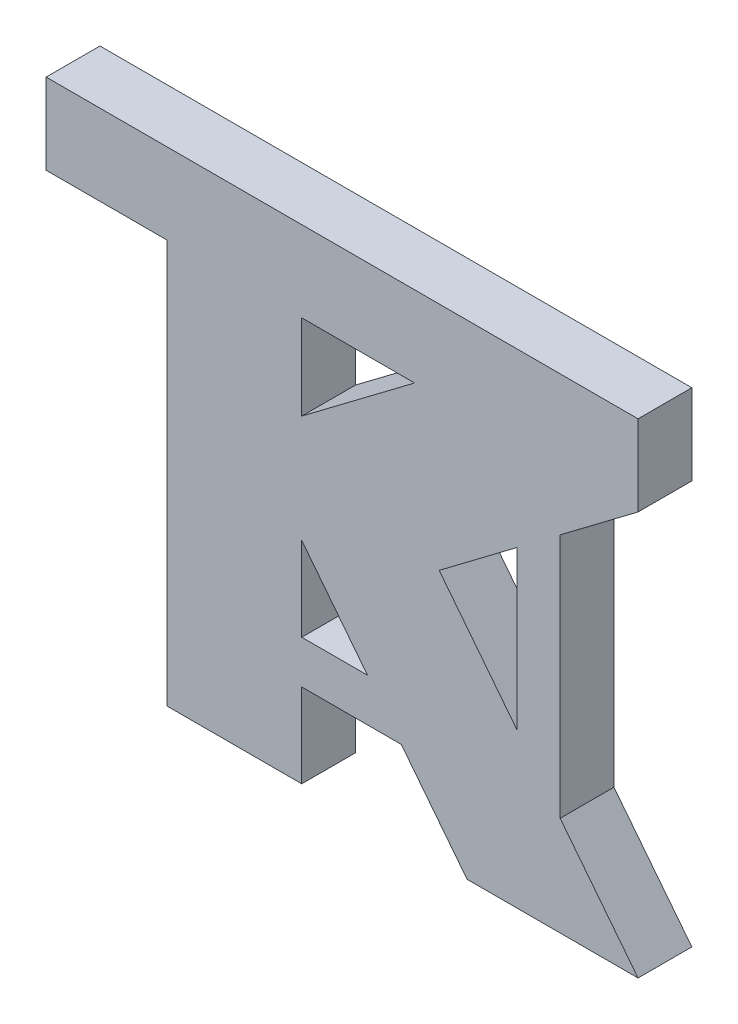
ISO-10303-21;
HEADER;
FILE_DESCRIPTION(('STEP AP214'),'2;1');
FILE_NAME('part.step','',(''),(''),'','','');
FILE_SCHEMA(('AUTOMOTIVE_DESIGN { 1 0 10303 214 1 1 1 1 }'));
ENDSEC;
DATA;
#1=APPLICATION_CONTEXT('core data for automotive mechanical design processes');
#2=APPLICATION_PROTOCOL_DEFINITION('international standard','automotive_design',2000,#1);
#3=PRODUCT_CONTEXT('',#1,'mechanical');
#4=PRODUCT('Part','Part','',(#3));
#5=PRODUCT_RELATED_PRODUCT_CATEGORY('part','',(#4));
#6=PRODUCT_DEFINITION_FORMATION('','',#4);
#7=PRODUCT_DEFINITION_CONTEXT('part definition',#1,'design');
#8=PRODUCT_DEFINITION('design','',#6,#7);
#9=PRODUCT_DEFINITION_SHAPE('','',#8);
#10=(LENGTH_UNIT() NAMED_UNIT(*) SI_UNIT(.MILLI.,.METRE.));
#11=(NAMED_UNIT(*) PLANE_ANGLE_UNIT() SI_UNIT($,.RADIAN.));
#12=(NAMED_UNIT(*) SI_UNIT($,.STERADIAN.) SOLID_ANGLE_UNIT());
#13=UNCERTAINTY_MEASURE_WITH_UNIT(LENGTH_MEASURE(1.E-05),#10,'distance_accuracy_value','');
#14=(GEOMETRIC_REPRESENTATION_CONTEXT(3) GLOBAL_UNCERTAINTY_ASSIGNED_CONTEXT((#13)) GLOBAL_UNIT_ASSIGNED_CONTEXT((#10,
#11,#12)) REPRESENTATION_CONTEXT('',''));
#15=CARTESIAN_POINT('',(0.,0.,0.));
#16=DIRECTION('',(0.,0.,1.));
#17=DIRECTION('',(1.,0.,0.));
#18=AXIS2_PLACEMENT_3D('',#15,#16,#17);
#19=CARTESIAN_POINT('',(-19.3889426707141,25.7141511353692,10.));
#20=DIRECTION('',(0.602051468260526,-0.798457280989625,0.));
#21=DIRECTION('',(0.798457280989625,0.602051468260526,0.));
#22=AXIS2_PLACEMENT_3D('',#19,#20,#21);
#23=PLANE('',#22);
#24=DIRECTION('',(-0.798457280989625,-0.602051468260526,0.));
#25=VECTOR('',#24,1.);
#26=CARTESIAN_POINT('',(-19.3889426707141,25.7141511353692,0.));
#27=LINE('',#26,#25);
#28=CARTESIAN_POINT('',(45.9753109692912,75.,0.));
#29=VERTEX_POINT('',#28);
#30=CARTESIAN_POINT('',(25.,59.1842299307094,0.));
#31=VERTEX_POINT('',#30);
#32=EDGE_CURVE('E209',#29,#31,#27,.T.);
#33=ORIENTED_EDGE('',*,*,#32,.T.);
#34=DIRECTION('',(0.,0.,-1.));
#35=VECTOR('',#34,1.);
#36=CARTESIAN_POINT('',(25.,59.1842299307094,10.));
#37=LINE('',#36,#35);
#38=CARTESIAN_POINT('',(25.,59.1842299307094,10.));
#39=VERTEX_POINT('',#38);
#40=EDGE_CURVE('E12',#39,#31,#37,.T.);
#41=ORIENTED_EDGE('',*,*,#40,.F.);
#42=DIRECTION('',(-0.798457280989625,-0.602051468260526,0.));
#43=VECTOR('',#42,1.);
#44=CARTESIAN_POINT('',(-19.3889426707141,25.7141511353692,10.));
#45=LINE('',#44,#43);
#46=CARTESIAN_POINT('',(45.9753109692912,75.,10.));
#47=VERTEX_POINT('',#46);
#48=EDGE_CURVE('E200',#47,#39,#45,.T.);
#49=ORIENTED_EDGE('',*,*,#48,.F.);
#50=DIRECTION('',(0.,0.,-1.));
#51=VECTOR('',#50,1.);
#52=CARTESIAN_POINT('',(45.9753109692912,75.,10.));
#53=LINE('',#52,#51);
#54=EDGE_CURVE('E210',#47,#29,#53,.T.);
#55=ORIENTED_EDGE('',*,*,#54,.T.);
#56=EDGE_LOOP('',(#33,#41,#49,#55));
#57=FACE_BOUND('',#56,.T.);
#58=ADVANCED_FACE('F38',(#57),#23,.F.);
#59=CARTESIAN_POINT('',(25.,0.,10.));
#60=DIRECTION('',(-1.,0.,0.));
#61=DIRECTION('',(0.,-1.,0.));
#62=AXIS2_PLACEMENT_3D('',#59,#60,#61);
#63=PLANE('',#62);
#64=DIRECTION('',(0.,1.,0.));
#65=VECTOR('',#64,1.);
#66=CARTESIAN_POINT('',(25.,0.,0.));
#67=LINE('',#66,#65);
#68=CARTESIAN_POINT('',(25.,75.,0.));
#69=VERTEX_POINT('',#68);
#70=EDGE_CURVE('E126',#31,#69,#67,.T.);
#71=ORIENTED_EDGE('',*,*,#70,.T.);
#72=DIRECTION('',(0.,0.,-1.));
#73=VECTOR('',#72,1.);
#74=CARTESIAN_POINT('',(25.,75.,10.));
#75=LINE('',#74,#73);
#76=CARTESIAN_POINT('',(25.,75.,10.));
#77=VERTEX_POINT('',#76);
#78=EDGE_CURVE('E48',#77,#69,#75,.T.);
#79=ORIENTED_EDGE('',*,*,#78,.F.);
#80=DIRECTION('',(0.,1.,0.));
#81=VECTOR('',#80,1.);
#82=CARTESIAN_POINT('',(25.,0.,10.));
#83=LINE('',#82,#81);
#84=EDGE_CURVE('E195',#39,#77,#83,.T.);
#85=ORIENTED_EDGE('',*,*,#84,.F.);
#86=ORIENTED_EDGE('',*,*,#40,.T.);
#87=EDGE_LOOP('',(#71,#79,#85,#86));
#88=FACE_BOUND('',#87,.T.);
#89=ADVANCED_FACE('F196',(#88),#63,.F.);
#90=CARTESIAN_POINT('',(65.0194710955794,0.,10.));
#91=DIRECTION('',(1.,0.,0.));
#92=DIRECTION('',(0.,0.,-1.));
#93=AXIS2_PLACEMENT_3D('',#90,#91,#92);
#94=PLANE('',#93);
#95=DIRECTION('',(0.,-1.,0.));
#96=VECTOR('',#95,1.);
#97=CARTESIAN_POINT('',(65.0194710955794,0.,0.));
#98=LINE('',#97,#96);
#99=CARTESIAN_POINT('',(65.0194710955794,58.0492679365328,0.));
#100=VERTEX_POINT('',#99);
#101=CARTESIAN_POINT('',(65.0194710955794,28.6659187518739,0.));
#102=VERTEX_POINT('',#101);
#103=EDGE_CURVE('E220',#100,#102,#98,.T.);
#104=ORIENTED_EDGE('',*,*,#103,.T.);
#105=DIRECTION('',(0.,0.,-1.));
#106=VECTOR('',#105,1.);
#107=CARTESIAN_POINT('',(65.0194710955794,28.6659187518739,10.));
#108=LINE('',#107,#106);
#109=CARTESIAN_POINT('',(65.0194710955794,28.6659187518739,10.));
#110=VERTEX_POINT('',#109);
#111=EDGE_CURVE('E226',#110,#102,#108,.T.);
#112=ORIENTED_EDGE('',*,*,#111,.F.);
#113=DIRECTION('',(0.,-1.,0.));
#114=VECTOR('',#113,1.);
#115=CARTESIAN_POINT('',(65.0194710955794,0.,10.));
#116=LINE('',#115,#114);
#117=CARTESIAN_POINT('',(65.0194710955794,58.0492679365328,10.));
#118=VERTEX_POINT('',#117);
#119=EDGE_CURVE('E381',#118,#110,#116,.T.);
#120=ORIENTED_EDGE('',*,*,#119,.F.);
#121=DIRECTION('',(0.,0.,-1.));
#122=VECTOR('',#121,1.);
#123=CARTESIAN_POINT('',(65.0194710955794,58.0492679365328,10.));
#124=LINE('',#123,#122);
#125=EDGE_CURVE('E228',#118,#100,#124,.T.);
#126=ORIENTED_EDGE('',*,*,#125,.T.);
#127=EDGE_LOOP('',(#104,#112,#120,#126));
#128=FACE_BOUND('',#127,.T.);
#129=ADVANCED_FACE('F349',(#128),#94,.F.);
#130=CARTESIAN_POINT('',(54.1792719022603,42.4887371851497,10.));
#131=DIRECTION('',(0.786887335571602,0.617096687008628,0.));
#132=DIRECTION('',(-0.617096687008628,0.786887335571602,0.));
#133=AXIS2_PLACEMENT_3D('',#130,#131,#132);
#134=PLANE('',#133);
#135=DIRECTION('',(0.617096687008629,-0.786887335571602,0.));
#136=VECTOR('',#135,1.);
#137=CARTESIAN_POINT('',(54.1792719022603,42.4887371851497,0.));
#138=LINE('',#137,#136);
#139=CARTESIAN_POINT('',(50.5389421911588,47.130682940614,0.));
#140=VERTEX_POINT('',#139);
#141=EDGE_CURVE('E216',#140,#102,#138,.T.);
#142=ORIENTED_EDGE('',*,*,#141,.F.);
#143=DIRECTION('',(0.,0.,-1.));
#144=VECTOR('',#143,1.);
#145=CARTESIAN_POINT('',(50.5389421911588,47.130682940614,10.));
#146=LINE('',#145,#144);
#147=CARTESIAN_POINT('',(50.5389421911588,47.130682940614,10.));
#148=VERTEX_POINT('',#147);
#149=EDGE_CURVE('E230',#148,#140,#146,.T.);
#150=ORIENTED_EDGE('',*,*,#149,.F.);
#151=DIRECTION('',(0.617096687008629,-0.786887335571602,0.));
#152=VECTOR('',#151,1.);
#153=CARTESIAN_POINT('',(54.1792719022603,42.4887371851497,10.));
#154=LINE('',#153,#152);
#155=EDGE_CURVE('E376',#148,#110,#154,.T.);
#156=ORIENTED_EDGE('',*,*,#155,.T.);
#157=ORIENTED_EDGE('',*,*,#111,.T.);
#158=EDGE_LOOP('',(#142,#150,#156,#157));
#159=FACE_BOUND('',#158,.T.);
#160=ADVANCED_FACE('F358',(#159),#134,.T.);
#161=CARTESIAN_POINT('',(0.,23.5921149653551,10.));
#162=DIRECTION('',(0.,1.,0.));
#163=DIRECTION('',(0.,0.,1.));
#164=AXIS2_PLACEMENT_3D('',#161,#162,#163);
#165=PLANE('',#164);
#166=DIRECTION('',(1.,0.,0.));
#167=VECTOR('',#166,1.);
#168=CARTESIAN_POINT('',(0.,23.5921149653551,0.));
#169=LINE('',#168,#167);
#170=CARTESIAN_POINT('',(25.,23.5921149653551,0.));
#171=VERTEX_POINT('',#170);
#172=CARTESIAN_POINT('',(37.2277256903476,23.5921149653551,0.));
#173=VERTEX_POINT('',#172);
#174=EDGE_CURVE('E288',#171,#173,#169,.T.);
#175=ORIENTED_EDGE('',*,*,#174,.F.);
#176=DIRECTION('',(0.,0.,-1.));
#177=VECTOR('',#176,1.);
#178=CARTESIAN_POINT('',(25.,23.5921149653551,10.));
#179=LINE('',#178,#177);
#180=CARTESIAN_POINT('',(25.,23.5921149653551,10.));
#181=VERTEX_POINT('',#180);
#182=EDGE_CURVE('E231',#181,#171,#179,.T.);
#183=ORIENTED_EDGE('',*,*,#182,.F.);
#184=DIRECTION('',(1.,0.,0.));
#185=VECTOR('',#184,1.);
#186=CARTESIAN_POINT('',(0.,23.5921149653551,10.));
#187=LINE('',#186,#185);
#188=CARTESIAN_POINT('',(37.2277256903476,23.5921149653551,10.));
#189=VERTEX_POINT('',#188);
#190=EDGE_CURVE('E432',#181,#189,#187,.T.);
#191=ORIENTED_EDGE('',*,*,#190,.T.);
#192=DIRECTION('',(0.,0.,-1.));
#193=VECTOR('',#192,1.);
#194=CARTESIAN_POINT('',(37.2277256903476,23.5921149653551,10.));
#195=LINE('',#194,#193);
#196=EDGE_CURVE('E234',#189,#173,#195,.T.);
#197=ORIENTED_EDGE('',*,*,#196,.T.);
#198=EDGE_LOOP('',(#175,#183,#191,#197));
#199=FACE_BOUND('',#198,.T.);
#200=ADVANCED_FACE('F360',(#199),#165,.T.);
#201=CARTESIAN_POINT('',(25.,0.,10.));
#202=DIRECTION('',(1.,0.,0.));
#203=DIRECTION('',(0.,1.,0.));
#204=AXIS2_PLACEMENT_3D('',#201,#202,#203);
#205=PLANE('',#204);
#206=DIRECTION('',(0.,-1.,0.));
#207=VECTOR('',#206,1.);
#208=CARTESIAN_POINT('',(25.,0.,0.));
#209=LINE('',#208,#207);
#210=CARTESIAN_POINT('',(25.,39.1842299307094,0.));
#211=VERTEX_POINT('',#210);
#212=EDGE_CURVE('E285',#211,#171,#209,.T.);
#213=ORIENTED_EDGE('',*,*,#212,.F.);
#214=DIRECTION('',(0.,0.,-1.));
#215=VECTOR('',#214,1.);
#216=CARTESIAN_POINT('',(25.,39.1842299307094,10.));
#217=LINE('',#216,#215);
#218=CARTESIAN_POINT('',(25.,39.1842299307094,10.));
#219=VERTEX_POINT('',#218);
#220=EDGE_CURVE('E236',#219,#211,#217,.T.);
#221=ORIENTED_EDGE('',*,*,#220,.F.);
#222=DIRECTION('',(0.,-1.,0.));
#223=VECTOR('',#222,1.);
#224=CARTESIAN_POINT('',(25.,0.,10.));
#225=LINE('',#224,#223);
#226=EDGE_CURVE('E442',#219,#181,#225,.T.);
#227=ORIENTED_EDGE('',*,*,#226,.T.);
#228=ORIENTED_EDGE('',*,*,#182,.T.);
#229=EDGE_LOOP('',(#213,#221,#227,#228));
#230=FACE_BOUND('',#229,.T.);
#231=ADVANCED_FACE('F531',(#230),#205,.T.);
#232=CARTESIAN_POINT('',(25.,15.5921149653551,0.));
#233=VERTEX_POINT('',#232);
#234=CARTESIAN_POINT('',(25.,0.,0.));
#235=VERTEX_POINT('',#234);
#236=EDGE_CURVE('E278',#233,#235,#209,.T.);
#237=ORIENTED_EDGE('',*,*,#236,.F.);
#238=DIRECTION('',(0.,0.,-1.));
#239=VECTOR('',#238,1.);
#240=CARTESIAN_POINT('',(25.,15.5921149653551,10.));
#241=LINE('',#240,#239);
#242=CARTESIAN_POINT('',(25.,15.5921149653551,10.));
#243=VERTEX_POINT('',#242);
#244=EDGE_CURVE('E42',#243,#233,#241,.T.);
#245=ORIENTED_EDGE('',*,*,#244,.F.);
#246=CARTESIAN_POINT('',(25.,0.,10.));
#247=VERTEX_POINT('',#246);
#248=EDGE_CURVE('E224',#243,#247,#225,.T.);
#249=ORIENTED_EDGE('',*,*,#248,.T.);
#250=DIRECTION('',(0.,0.,-1.));
#251=VECTOR('',#250,1.);
#252=CARTESIAN_POINT('',(25.,0.,10.));
#253=LINE('',#252,#251);
#254=EDGE_CURVE('E239',#247,#235,#253,.T.);
#255=ORIENTED_EDGE('',*,*,#254,.T.);
#256=EDGE_LOOP('',(#237,#245,#249,#255));
#257=FACE_BOUND('',#256,.T.);
#258=ADVANCED_FACE('F283',(#257),#205,.T.);
#259=CARTESIAN_POINT('',(0.,15.5921149653551,10.));
#260=DIRECTION('',(0.,1.,0.));
#261=DIRECTION('',(0.,0.,1.));
#262=AXIS2_PLACEMENT_3D('',#259,#260,#261);
#263=PLANE('',#262);
#264=DIRECTION('',(1.,0.,0.));
#265=VECTOR('',#264,1.);
#266=CARTESIAN_POINT('',(0.,15.5921149653551,0.));
#267=LINE('',#266,#265);
#268=CARTESIAN_POINT('',(43.5015253474269,15.5921149653551,0.));
#269=VERTEX_POINT('',#268);
#270=EDGE_CURVE('E269',#233,#269,#267,.T.);
#271=ORIENTED_EDGE('',*,*,#270,.T.);
#272=DIRECTION('',(0.,0.,-1.));
#273=VECTOR('',#272,1.);
#274=CARTESIAN_POINT('',(43.5015253474269,15.5921149653551,10.));
#275=LINE('',#274,#273);
#276=CARTESIAN_POINT('',(43.5015253474269,15.5921149653551,10.));
#277=VERTEX_POINT('',#276);
#278=EDGE_CURVE('E261',#277,#269,#275,.T.);
#279=ORIENTED_EDGE('',*,*,#278,.F.);
#280=DIRECTION('',(1.,0.,0.));
#281=VECTOR('',#280,1.);
#282=CARTESIAN_POINT('',(0.,15.5921149653551,10.));
#283=LINE('',#282,#281);
#284=EDGE_CURVE('E271',#243,#277,#283,.T.);
#285=ORIENTED_EDGE('',*,*,#284,.F.);
#286=ORIENTED_EDGE('',*,*,#244,.T.);
#287=EDGE_LOOP('',(#271,#279,#285,#286));
#288=FACE_BOUND('',#287,.T.);
#289=ADVANCED_FACE('F40',(#288),#263,.F.);
#290=CARTESIAN_POINT('',(34.50708851297,27.0613200099346,10.));
#291=DIRECTION('',(-0.786887335571593,-0.61709668700864,0.));
#292=DIRECTION('',(0.61709668700864,-0.786887335571593,0.));
#293=AXIS2_PLACEMENT_3D('',#290,#291,#292);
#294=PLANE('',#293);
#295=DIRECTION('',(-0.61709668700864,0.786887335571593,0.));
#296=VECTOR('',#295,1.);
#297=CARTESIAN_POINT('',(34.50708851297,27.0613200099346,0.));
#298=LINE('',#297,#296);
#299=CARTESIAN_POINT('',(55.7292510377752,0.,0.));
#300=VERTEX_POINT('',#299);
#301=EDGE_CURVE('E281',#300,#269,#298,.T.);
#302=ORIENTED_EDGE('',*,*,#301,.F.);
#303=DIRECTION('',(0.,0.,-1.));
#304=VECTOR('',#303,1.);
#305=CARTESIAN_POINT('',(55.7292510377752,0.,10.));
#306=LINE('',#305,#304);
#307=CARTESIAN_POINT('',(55.7292510377752,0.,10.));
#308=VERTEX_POINT('',#307);
#309=EDGE_CURVE('E260',#308,#300,#306,.T.);
#310=ORIENTED_EDGE('',*,*,#309,.F.);
#311=DIRECTION('',(-0.61709668700864,0.786887335571593,0.));
#312=VECTOR('',#311,1.);
#313=CARTESIAN_POINT('',(34.50708851297,27.0613200099346,10.));
#314=LINE('',#313,#312);
#315=EDGE_CURVE('E400',#308,#277,#314,.T.);
#316=ORIENTED_EDGE('',*,*,#315,.T.);
#317=ORIENTED_EDGE('',*,*,#278,.T.);
#318=EDGE_LOOP('',(#302,#310,#316,#317));
#319=FACE_BOUND('',#318,.T.);
#320=ADVANCED_FACE('F329',(#319),#294,.T.);
#321=CARTESIAN_POINT('',(0.,0.,10.));
#322=DIRECTION('',(0.,-1.,0.));
#323=DIRECTION('',(1.,0.,0.));
#324=AXIS2_PLACEMENT_3D('',#321,#322,#323);
#325=PLANE('',#324);
#326=DIRECTION('',(-1.,0.,0.));
#327=VECTOR('',#326,1.);
#328=CARTESIAN_POINT('',(0.,0.,0.));
#329=LINE('',#328,#327);
#330=CARTESIAN_POINT('',(87.5,0.,0.));
#331=VERTEX_POINT('',#330);
#332=EDGE_CURVE('E319',#331,#300,#329,.T.);
#333=ORIENTED_EDGE('',*,*,#332,.F.);
#334=DIRECTION('',(0.,0.,-1.));
#335=VECTOR('',#334,1.);
#336=CARTESIAN_POINT('',(87.5,0.,10.));
#337=LINE('',#336,#335);
#338=CARTESIAN_POINT('',(87.5,0.,10.));
#339=VERTEX_POINT('',#338);
#340=EDGE_CURVE('E258',#339,#331,#337,.T.);
#341=ORIENTED_EDGE('',*,*,#340,.F.);
#342=DIRECTION('',(-1.,0.,0.));
#343=VECTOR('',#342,1.);
#344=CARTESIAN_POINT('',(0.,0.,10.));
#345=LINE('',#344,#343);
#346=EDGE_CURVE('E327',#339,#308,#345,.T.);
#347=ORIENTED_EDGE('',*,*,#346,.T.);
#348=ORIENTED_EDGE('',*,*,#309,.T.);
#349=EDGE_LOOP('',(#333,#341,#347,#348));
#350=FACE_BOUND('',#349,.T.);
#351=ADVANCED_FACE('F324',(#350),#325,.T.);
#352=CARTESIAN_POINT('',(73.0194710955794,18.46476418874,0.));
#353=VERTEX_POINT('',#352);
#354=EDGE_CURVE('E316',#353,#331,#138,.T.);
#355=ORIENTED_EDGE('',*,*,#354,.F.);
#356=DIRECTION('',(0.,0.,-1.));
#357=VECTOR('',#356,1.);
#358=CARTESIAN_POINT('',(73.0194710955794,18.46476418874,10.));
#359=LINE('',#358,#357);
#360=CARTESIAN_POINT('',(73.0194710955794,18.46476418874,10.));
#361=VERTEX_POINT('',#360);
#362=EDGE_CURVE('E256',#361,#353,#359,.T.);
#363=ORIENTED_EDGE('',*,*,#362,.F.);
#364=EDGE_CURVE('E383',#361,#339,#154,.T.);
#365=ORIENTED_EDGE('',*,*,#364,.T.);
#366=ORIENTED_EDGE('',*,*,#340,.T.);
#367=EDGE_LOOP('',(#355,#363,#365,#366));
#368=FACE_BOUND('',#367,.T.);
#369=ADVANCED_FACE('F337',(#368),#134,.T.);
#370=CARTESIAN_POINT('',(73.0194710955794,0.,10.));
#371=DIRECTION('',(-1.,0.,0.));
#372=DIRECTION('',(0.,0.,1.));
#373=AXIS2_PLACEMENT_3D('',#370,#371,#372);
#374=PLANE('',#373);
#375=DIRECTION('',(0.,1.,0.));
#376=VECTOR('',#375,1.);
#377=CARTESIAN_POINT('',(73.0194710955794,0.,0.));
#378=LINE('',#377,#376);
#379=CARTESIAN_POINT('',(73.0194710955794,64.0814150040812,0.));
#380=VERTEX_POINT('',#379);
#381=EDGE_CURVE('E313',#353,#380,#378,.T.);
#382=ORIENTED_EDGE('',*,*,#381,.T.);
#383=DIRECTION('',(0.,0.,-1.));
#384=VECTOR('',#383,1.);
#385=CARTESIAN_POINT('',(73.0194710955794,64.0814150040812,10.));
#386=LINE('',#385,#384);
#387=CARTESIAN_POINT('',(73.0194710955794,64.0814150040812,10.));
#388=VERTEX_POINT('',#387);
#389=EDGE_CURVE('E254',#388,#380,#386,.T.);
#390=ORIENTED_EDGE('',*,*,#389,.F.);
#391=DIRECTION('',(0.,1.,0.));
#392=VECTOR('',#391,1.);
#393=CARTESIAN_POINT('',(73.0194710955794,0.,10.));
#394=LINE('',#393,#392);
#395=EDGE_CURVE('E395',#361,#388,#394,.T.);
#396=ORIENTED_EDGE('',*,*,#395,.F.);
#397=ORIENTED_EDGE('',*,*,#362,.T.);
#398=EDGE_LOOP('',(#382,#390,#396,#397));
#399=FACE_BOUND('',#398,.T.);
#400=ADVANCED_FACE('F507',(#399),#374,.F.);
#401=CARTESIAN_POINT('',(-4.33765596420094,5.75271911062855,10.));
#402=DIRECTION('',(0.602051468260527,-0.798457280989624,0.));
#403=DIRECTION('',(0.798457280989624,0.602051468260527,0.));
#404=AXIS2_PLACEMENT_3D('',#401,#402,#403);
#405=PLANE('',#404);
#406=DIRECTION('',(-0.798457280989624,-0.602051468260527,0.));
#407=VECTOR('',#406,1.);
#408=CARTESIAN_POINT('',(-4.33765596420094,5.75271911062855,0.));
#409=LINE('',#408,#407);
#410=CARTESIAN_POINT('',(87.5,75.,0.));
#411=VERTEX_POINT('',#410);
#412=EDGE_CURVE('E218',#411,#380,#409,.T.);
#413=ORIENTED_EDGE('',*,*,#412,.F.);
#414=DIRECTION('',(0.,0.,-1.));
#415=VECTOR('',#414,1.);
#416=CARTESIAN_POINT('',(87.5,75.,10.));
#417=LINE('',#416,#415);
#418=CARTESIAN_POINT('',(87.5,75.,10.));
#419=VERTEX_POINT('',#418);
#420=EDGE_CURVE('E252',#419,#411,#417,.T.);
#421=ORIENTED_EDGE('',*,*,#420,.F.);
#422=DIRECTION('',(-0.798457280989624,-0.602051468260527,0.));
#423=VECTOR('',#422,1.);
#424=CARTESIAN_POINT('',(-4.33765596420094,5.75271911062855,10.));
#425=LINE('',#424,#423);
#426=EDGE_CURVE('E387',#419,#388,#425,.T.);
#427=ORIENTED_EDGE('',*,*,#426,.T.);
#428=ORIENTED_EDGE('',*,*,#389,.T.);
#429=EDGE_LOOP('',(#413,#421,#427,#428));
#430=FACE_BOUND('',#429,.T.);
#431=ADVANCED_FACE('F357',(#430),#405,.T.);
#432=CARTESIAN_POINT('',(87.4999999999999,0.,10.));
#433=DIRECTION('',(-1.,0.,0.));
#434=DIRECTION('',(0.,-1.,0.));
#435=AXIS2_PLACEMENT_3D('',#432,#433,#434);
#436=PLANE('',#435);
#437=DIRECTION('',(0.,1.,0.));
#438=VECTOR('',#437,1.);
#439=CARTESIAN_POINT('',(87.4999999999999,0.,0.));
#440=LINE('',#439,#438);
#441=CARTESIAN_POINT('',(87.5,90.,0.));
#442=VERTEX_POINT('',#441);
#443=EDGE_CURVE('E310',#411,#442,#440,.T.);
#444=ORIENTED_EDGE('',*,*,#443,.T.);
#445=DIRECTION('',(0.,0.,-1.));
#446=VECTOR('',#445,1.);
#447=CARTESIAN_POINT('',(87.5,90.,10.));
#448=LINE('',#447,#446);
#449=CARTESIAN_POINT('',(87.5,90.,10.));
#450=VERTEX_POINT('',#449);
#451=EDGE_CURVE('E249',#450,#442,#448,.T.);
#452=ORIENTED_EDGE('',*,*,#451,.F.);
#453=DIRECTION('',(0.,1.,0.));
#454=VECTOR('',#453,1.);
#455=CARTESIAN_POINT('',(87.4999999999999,0.,10.));
#456=LINE('',#455,#454);
#457=EDGE_CURVE('E418',#419,#450,#456,.T.);
#458=ORIENTED_EDGE('',*,*,#457,.F.);
#459=ORIENTED_EDGE('',*,*,#420,.T.);
#460=EDGE_LOOP('',(#444,#452,#458,#459));
#461=FACE_BOUND('',#460,.T.);
#462=ADVANCED_FACE('F489',(#461),#436,.F.);
#463=CARTESIAN_POINT('',(0.,90.,10.));
#464=DIRECTION('',(0.,-1.,0.));
#465=DIRECTION('',(0.,0.,-1.));
#466=AXIS2_PLACEMENT_3D('',#463,#464,#465);
#467=PLANE('',#466);
#468=DIRECTION('',(-1.,0.,0.));
#469=VECTOR('',#468,1.);
#470=CARTESIAN_POINT('',(0.,90.,0.));
#471=LINE('',#470,#469);
#472=CARTESIAN_POINT('',(-22.5,90.,0.));
#473=VERTEX_POINT('',#472);
#474=EDGE_CURVE('E307',#442,#473,#471,.T.);
#475=ORIENTED_EDGE('',*,*,#474,.T.);
#476=DIRECTION('',(0.,0.,-1.));
#477=VECTOR('',#476,1.);
#478=CARTESIAN_POINT('',(-22.5,90.,10.));
#479=LINE('',#478,#477);
#480=CARTESIAN_POINT('',(-22.5,90.,10.));
#481=VERTEX_POINT('',#480);
#482=EDGE_CURVE('E247',#481,#473,#479,.T.);
#483=ORIENTED_EDGE('',*,*,#482,.F.);
#484=DIRECTION('',(-1.,0.,0.));
#485=VECTOR('',#484,1.);
#486=CARTESIAN_POINT('',(0.,90.,10.));
#487=LINE('',#486,#485);
#488=EDGE_CURVE('E478',#450,#481,#487,.T.);
#489=ORIENTED_EDGE('',*,*,#488,.F.);
#490=ORIENTED_EDGE('',*,*,#451,.T.);
#491=EDGE_LOOP('',(#475,#483,#489,#490));
#492=FACE_BOUND('',#491,.T.);
#493=ADVANCED_FACE('F493',(#492),#467,.F.);
#494=CARTESIAN_POINT('',(-22.5,0.,10.));
#495=DIRECTION('',(-1.,0.,0.));
#496=DIRECTION('',(0.,-1.,0.));
#497=AXIS2_PLACEMENT_3D('',#494,#495,#496);
#498=PLANE('',#497);
#499=DIRECTION('',(0.,1.,0.));
#500=VECTOR('',#499,1.);
#501=CARTESIAN_POINT('',(-22.5,0.,0.));
#502=LINE('',#501,#500);
#503=CARTESIAN_POINT('',(-22.5,75.,0.));
#504=VERTEX_POINT('',#503);
#505=EDGE_CURVE('E304',#504,#473,#502,.T.);
#506=ORIENTED_EDGE('',*,*,#505,.F.);
#507=DIRECTION('',(0.,0.,-1.));
#508=VECTOR('',#507,1.);
#509=CARTESIAN_POINT('',(-22.5,75.,10.));
#510=LINE('',#509,#508);
#511=CARTESIAN_POINT('',(-22.5,75.,10.));
#512=VERTEX_POINT('',#511);
#513=EDGE_CURVE('E245',#512,#504,#510,.T.);
#514=ORIENTED_EDGE('',*,*,#513,.F.);
#515=DIRECTION('',(0.,1.,0.));
#516=VECTOR('',#515,1.);
#517=CARTESIAN_POINT('',(-22.5,0.,10.));
#518=LINE('',#517,#516);
#519=EDGE_CURVE('E474',#512,#481,#518,.T.);
#520=ORIENTED_EDGE('',*,*,#519,.T.);
#521=ORIENTED_EDGE('',*,*,#482,.T.);
#522=EDGE_LOOP('',(#506,#514,#520,#521));
#523=FACE_BOUND('',#522,.T.);
#524=ADVANCED_FACE('F496',(#523),#498,.T.);
#525=CARTESIAN_POINT('',(0.,75.,10.));
#526=DIRECTION('',(0.,-1.,0.));
#527=DIRECTION('',(0.,0.,-1.));
#528=AXIS2_PLACEMENT_3D('',#525,#526,#527);
#529=PLANE('',#528);
#530=DIRECTION('',(-1.,0.,0.));
#531=VECTOR('',#530,1.);
#532=CARTESIAN_POINT('',(0.,75.,0.));
#533=LINE('',#532,#531);
#534=CARTESIAN_POINT('',(0.,75.,0.));
#535=VERTEX_POINT('',#534);
#536=EDGE_CURVE('E301',#535,#504,#533,.T.);
#537=ORIENTED_EDGE('',*,*,#536,.F.);
#538=DIRECTION('',(0.,0.,-1.));
#539=VECTOR('',#538,1.);
#540=CARTESIAN_POINT('',(0.,75.,10.));
#541=LINE('',#540,#539);
#542=CARTESIAN_POINT('',(0.,75.,10.));
#543=VERTEX_POINT('',#542);
#544=EDGE_CURVE('E243',#543,#535,#541,.T.);
#545=ORIENTED_EDGE('',*,*,#544,.F.);
#546=DIRECTION('',(-1.,0.,0.));
#547=VECTOR('',#546,1.);
#548=CARTESIAN_POINT('',(0.,75.,10.));
#549=LINE('',#548,#547);
#550=EDGE_CURVE('E461',#543,#512,#549,.T.);
#551=ORIENTED_EDGE('',*,*,#550,.T.);
#552=ORIENTED_EDGE('',*,*,#513,.T.);
#553=EDGE_LOOP('',(#537,#545,#551,#552));
#554=FACE_BOUND('',#553,.T.);
#555=ADVANCED_FACE('F499',(#554),#529,.T.);
#556=CARTESIAN_POINT('',(0.,0.,10.));
#557=DIRECTION('',(-1.,0.,0.));
#558=DIRECTION('',(0.,0.,1.));
#559=AXIS2_PLACEMENT_3D('',#556,#557,#558);
#560=PLANE('',#559);
#561=DIRECTION('',(0.,1.,0.));
#562=VECTOR('',#561,1.);
#563=CARTESIAN_POINT('',(0.,0.,0.));
#564=LINE('',#563,#562);
#565=CARTESIAN_POINT('',(0.,0.,0.));
#566=VERTEX_POINT('',#565);
#567=EDGE_CURVE('E296',#566,#535,#564,.T.);
#568=ORIENTED_EDGE('',*,*,#567,.F.);
#569=DIRECTION('',(0.,0.,-1.));
#570=VECTOR('',#569,1.);
#571=CARTESIAN_POINT('',(0.,0.,10.));
#572=LINE('',#571,#570);
#573=CARTESIAN_POINT('',(0.,0.,10.));
#574=VERTEX_POINT('',#573);
#575=EDGE_CURVE('E241',#574,#566,#572,.T.);
#576=ORIENTED_EDGE('',*,*,#575,.F.);
#577=DIRECTION('',(0.,1.,0.));
#578=VECTOR('',#577,1.);
#579=CARTESIAN_POINT('',(0.,0.,10.));
#580=LINE('',#579,#578);
#581=EDGE_CURVE('E455',#574,#543,#580,.T.);
#582=ORIENTED_EDGE('',*,*,#581,.T.);
#583=ORIENTED_EDGE('',*,*,#544,.T.);
#584=EDGE_LOOP('',(#568,#576,#582,#583));
#585=FACE_BOUND('',#584,.T.);
#586=ADVANCED_FACE('F355',(#585),#560,.T.);
#587=EDGE_CURVE('E212',#100,#140,#409,.T.);
#588=ORIENTED_EDGE('',*,*,#587,.F.);
#589=ORIENTED_EDGE('',*,*,#125,.F.);
#590=EDGE_CURVE('E206',#118,#148,#425,.T.);
#591=ORIENTED_EDGE('',*,*,#590,.T.);
#592=ORIENTED_EDGE('',*,*,#149,.T.);
#593=EDGE_LOOP('',(#588,#589,#591,#592));
#594=FACE_BOUND('',#593,.T.);
#595=ADVANCED_FACE('F342',(#594),#405,.T.);
#596=EDGE_CURVE('E287',#173,#211,#298,.T.);
#597=ORIENTED_EDGE('',*,*,#596,.F.);
#598=ORIENTED_EDGE('',*,*,#196,.F.);
#599=EDGE_CURVE('E388',#189,#219,#314,.T.);
#600=ORIENTED_EDGE('',*,*,#599,.T.);
#601=ORIENTED_EDGE('',*,*,#220,.T.);
#602=EDGE_LOOP('',(#597,#598,#600,#601));
#603=FACE_BOUND('',#602,.T.);
#604=ADVANCED_FACE('F332',(#603),#294,.T.);
#605=CARTESIAN_POINT('',(0.,0.,10.));
#606=DIRECTION('',(0.,-1.,0.));
#607=DIRECTION('',(0.,0.,-1.));
#608=AXIS2_PLACEMENT_3D('',#605,#606,#607);
#609=PLANE('',#608);
#610=DIRECTION('',(-1.,0.,0.));
#611=VECTOR('',#610,1.);
#612=CARTESIAN_POINT('',(0.,0.,0.));
#613=LINE('',#612,#611);
#614=EDGE_CURVE('E293',#235,#566,#613,.T.);
#615=ORIENTED_EDGE('',*,*,#614,.F.);
#616=ORIENTED_EDGE('',*,*,#254,.F.);
#617=DIRECTION('',(-1.,0.,0.));
#618=VECTOR('',#617,1.);
#619=CARTESIAN_POINT('',(0.,0.,10.));
#620=LINE('',#619,#618);
#621=EDGE_CURVE('E452',#247,#574,#620,.T.);
#622=ORIENTED_EDGE('',*,*,#621,.T.);
#623=ORIENTED_EDGE('',*,*,#575,.T.);
#624=EDGE_LOOP('',(#615,#616,#622,#623));
#625=FACE_BOUND('',#624,.T.);
#626=ADVANCED_FACE('F341',(#625),#609,.T.);
#627=CARTESIAN_POINT('',(0.,75.,10.));
#628=DIRECTION('',(0.,1.,0.));
#629=DIRECTION('',(-1.,0.,0.));
#630=AXIS2_PLACEMENT_3D('',#627,#628,#629);
#631=PLANE('',#630);
#632=DIRECTION('',(1.,0.,0.));
#633=VECTOR('',#632,1.);
#634=CARTESIAN_POINT('',(0.,75.,0.));
#635=LINE('',#634,#633);
#636=EDGE_CURVE('E132',#69,#29,#635,.T.);
#637=ORIENTED_EDGE('',*,*,#636,.T.);
#638=ORIENTED_EDGE('',*,*,#54,.F.);
#639=DIRECTION('',(1.,0.,0.));
#640=VECTOR('',#639,1.);
#641=CARTESIAN_POINT('',(0.,75.,10.));
#642=LINE('',#641,#640);
#643=EDGE_CURVE('E57',#77,#47,#642,.T.);
#644=ORIENTED_EDGE('',*,*,#643,.F.);
#645=ORIENTED_EDGE('',*,*,#78,.T.);
#646=EDGE_LOOP('',(#637,#638,#644,#645));
#647=FACE_BOUND('',#646,.T.);
#648=ADVANCED_FACE('F529',(#647),#631,.F.);
#649=CARTESIAN_POINT('',(0.,0.,10.));
#650=DIRECTION('',(0.,0.,1.));
#651=DIRECTION('',(1.,0.,0.));
#652=AXIS2_PLACEMENT_3D('',#649,#650,#651);
#653=PLANE('',#652);
#654=ORIENTED_EDGE('',*,*,#248,.F.);
#655=ORIENTED_EDGE('',*,*,#284,.T.);
#656=ORIENTED_EDGE('',*,*,#315,.F.);
#657=ORIENTED_EDGE('',*,*,#346,.F.);
#658=ORIENTED_EDGE('',*,*,#364,.F.);
#659=ORIENTED_EDGE('',*,*,#395,.T.);
#660=ORIENTED_EDGE('',*,*,#426,.F.);
#661=ORIENTED_EDGE('',*,*,#457,.T.);
#662=ORIENTED_EDGE('',*,*,#488,.T.);
#663=ORIENTED_EDGE('',*,*,#519,.F.);
#664=ORIENTED_EDGE('',*,*,#550,.F.);
#665=ORIENTED_EDGE('',*,*,#581,.F.);
#666=ORIENTED_EDGE('',*,*,#621,.F.);
#667=EDGE_LOOP('',(#654,#655,#656,#657,#658,#659,#660,#661,#662,#663,#664,#665,#666));
#668=FACE_BOUND('',#667,.T.);
#669=ORIENTED_EDGE('',*,*,#190,.F.);
#670=ORIENTED_EDGE('',*,*,#226,.F.);
#671=ORIENTED_EDGE('',*,*,#599,.F.);
#672=EDGE_LOOP('',(#669,#670,#671));
#673=FACE_BOUND('',#672,.T.);
#674=ORIENTED_EDGE('',*,*,#119,.T.);
#675=ORIENTED_EDGE('',*,*,#155,.F.);
#676=ORIENTED_EDGE('',*,*,#590,.F.);
#677=EDGE_LOOP('',(#674,#675,#676));
#678=FACE_BOUND('',#677,.T.);
#679=ORIENTED_EDGE('',*,*,#48,.T.);
#680=ORIENTED_EDGE('',*,*,#84,.T.);
#681=ORIENTED_EDGE('',*,*,#643,.T.);
#682=EDGE_LOOP('',(#679,#680,#681));
#683=FACE_BOUND('',#682,.T.);
#684=ADVANCED_FACE('F203',(#668,#673,#678,#683),#653,.T.);
#685=CARTESIAN_POINT('',(0.,0.,0.));
#686=DIRECTION('',(0.,0.,1.));
#687=DIRECTION('',(1.,0.,0.));
#688=AXIS2_PLACEMENT_3D('',#685,#686,#687);
#689=PLANE('',#688);
#690=ORIENTED_EDGE('',*,*,#236,.T.);
#691=ORIENTED_EDGE('',*,*,#614,.T.);
#692=ORIENTED_EDGE('',*,*,#567,.T.);
#693=ORIENTED_EDGE('',*,*,#536,.T.);
#694=ORIENTED_EDGE('',*,*,#505,.T.);
#695=ORIENTED_EDGE('',*,*,#474,.F.);
#696=ORIENTED_EDGE('',*,*,#443,.F.);
#697=ORIENTED_EDGE('',*,*,#412,.T.);
#698=ORIENTED_EDGE('',*,*,#381,.F.);
#699=ORIENTED_EDGE('',*,*,#354,.T.);
#700=ORIENTED_EDGE('',*,*,#332,.T.);
#701=ORIENTED_EDGE('',*,*,#301,.T.);
#702=ORIENTED_EDGE('',*,*,#270,.F.);
#703=EDGE_LOOP('',(#690,#691,#692,#693,#694,#695,#696,#697,#698,#699,#700,#701,#702));
#704=FACE_BOUND('',#703,.T.);
#705=ORIENTED_EDGE('',*,*,#174,.T.);
#706=ORIENTED_EDGE('',*,*,#596,.T.);
#707=ORIENTED_EDGE('',*,*,#212,.T.);
#708=EDGE_LOOP('',(#705,#706,#707));
#709=FACE_BOUND('',#708,.T.);
#710=ORIENTED_EDGE('',*,*,#103,.F.);
#711=ORIENTED_EDGE('',*,*,#587,.T.);
#712=ORIENTED_EDGE('',*,*,#141,.T.);
#713=EDGE_LOOP('',(#710,#711,#712));
#714=FACE_BOUND('',#713,.T.);
#715=ORIENTED_EDGE('',*,*,#32,.F.);
#716=ORIENTED_EDGE('',*,*,#636,.F.);
#717=ORIENTED_EDGE('',*,*,#70,.F.);
#718=EDGE_LOOP('',(#715,#716,#717));
#719=FACE_BOUND('',#718,.T.);
#720=ADVANCED_FACE('F275',(#704,#709,#714,#719),#689,.F.);
#721=CLOSED_SHELL('',(#58,#89,#129,#160,#200,#231,#258,#289,#320,#351,#369,#400,#431,#462,#493,
#524,#555,#586,#595,#604,#626,#648,#684,#720));
#722=MANIFOLD_SOLID_BREP('B2',#721);
#723=ADVANCED_BREP_SHAPE_REPRESENTATION('',(#18,#722),#14);
#724=SHAPE_DEFINITION_REPRESENTATION(#9,#723);
ENDSEC;
END-ISO-10303-21;
